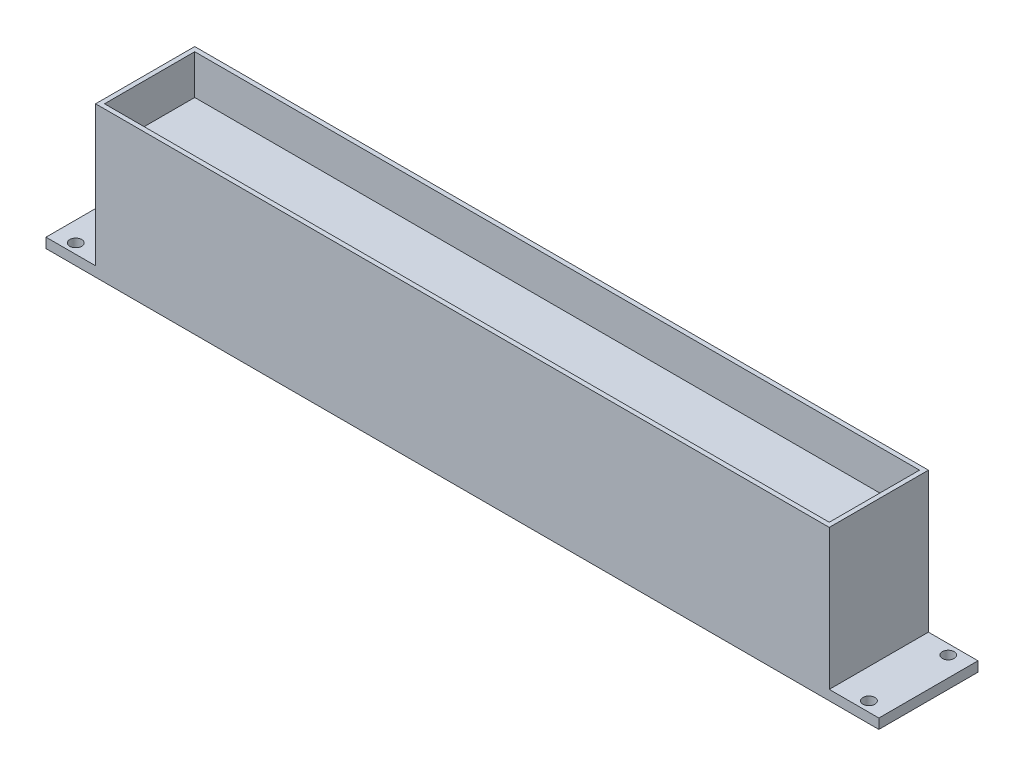
ISO-10303-21;
HEADER;
FILE_DESCRIPTION(('STEP AP214'),'2;1');
FILE_NAME('part.step','',(''),(''),'','','');
FILE_SCHEMA(('AUTOMOTIVE_DESIGN { 1 0 10303 214 1 1 1 1 }'));
ENDSEC;
DATA;
#1=APPLICATION_CONTEXT('core data for automotive mechanical design processes');
#2=APPLICATION_PROTOCOL_DEFINITION('international standard','automotive_design',2000,#1);
#3=PRODUCT_CONTEXT('',#1,'mechanical');
#4=PRODUCT('Part','Part','',(#3));
#5=PRODUCT_RELATED_PRODUCT_CATEGORY('part','',(#4));
#6=PRODUCT_DEFINITION_FORMATION('','',#4);
#7=PRODUCT_DEFINITION_CONTEXT('part definition',#1,'design');
#8=PRODUCT_DEFINITION('design','',#6,#7);
#9=PRODUCT_DEFINITION_SHAPE('','',#8);
#10=(LENGTH_UNIT() NAMED_UNIT(*) SI_UNIT(.MILLI.,.METRE.));
#11=(NAMED_UNIT(*) PLANE_ANGLE_UNIT() SI_UNIT($,.RADIAN.));
#12=(NAMED_UNIT(*) SI_UNIT($,.STERADIAN.) SOLID_ANGLE_UNIT());
#13=UNCERTAINTY_MEASURE_WITH_UNIT(LENGTH_MEASURE(1.E-05),#10,'distance_accuracy_value','');
#14=(GEOMETRIC_REPRESENTATION_CONTEXT(3) GLOBAL_UNCERTAINTY_ASSIGNED_CONTEXT((#13)) GLOBAL_UNIT_ASSIGNED_CONTEXT((#10,
#11,#12)) REPRESENTATION_CONTEXT('',''));
#15=CARTESIAN_POINT('',(0.,0.,0.));
#16=DIRECTION('',(0.,0.,1.));
#17=DIRECTION('',(1.,0.,0.));
#18=AXIS2_PLACEMENT_3D('',#15,#16,#17);
#19=CARTESIAN_POINT('',(0.,75.75,0.));
#20=DIRECTION('',(0.,-1.,0.));
#21=DIRECTION('',(0.,0.,-1.));
#22=AXIS2_PLACEMENT_3D('',#19,#20,#21);
#23=PLANE('',#22);
#24=DIRECTION('',(-1.,0.,0.));
#25=VECTOR('',#24,1.);
#26=CARTESIAN_POINT('',(-182.75,75.75,-22.75));
#27=LINE('',#26,#25);
#28=CARTESIAN_POINT('',(182.75,75.75,-22.75));
#29=VERTEX_POINT('',#28);
#30=CARTESIAN_POINT('',(-182.75,75.75,-22.75));
#31=VERTEX_POINT('',#30);
#32=EDGE_CURVE('E211',#29,#31,#27,.T.);
#33=ORIENTED_EDGE('',*,*,#32,.F.);
#34=DIRECTION('',(0.,0.,-1.));
#35=VECTOR('',#34,1.);
#36=CARTESIAN_POINT('',(182.75,75.75,22.75));
#37=LINE('',#36,#35);
#38=CARTESIAN_POINT('',(182.75,75.75,22.75));
#39=VERTEX_POINT('',#38);
#40=EDGE_CURVE('E176',#39,#29,#37,.T.);
#41=ORIENTED_EDGE('',*,*,#40,.F.);
#42=DIRECTION('',(1.,0.,0.));
#43=VECTOR('',#42,1.);
#44=CARTESIAN_POINT('',(-182.75,75.75,22.75));
#45=LINE('',#44,#43);
#46=CARTESIAN_POINT('',(-182.75,75.75,22.75));
#47=VERTEX_POINT('',#46);
#48=EDGE_CURVE('E196',#47,#39,#45,.T.);
#49=ORIENTED_EDGE('',*,*,#48,.F.);
#50=DIRECTION('',(0.,0.,1.));
#51=VECTOR('',#50,1.);
#52=CARTESIAN_POINT('',(-182.75,75.75,22.75));
#53=LINE('',#52,#51);
#54=EDGE_CURVE('E215',#31,#47,#53,.T.);
#55=ORIENTED_EDGE('',*,*,#54,.F.);
#56=EDGE_LOOP('',(#33,#41,#49,#55));
#57=FACE_BOUND('',#56,.T.);
#58=DIRECTION('',(0.,0.,-1.));
#59=VECTOR('',#58,1.);
#60=CARTESIAN_POINT('',(185.,75.75,25.));
#61=LINE('',#60,#59);
#62=CARTESIAN_POINT('',(185.,75.75,25.));
#63=VERTEX_POINT('',#62);
#64=CARTESIAN_POINT('',(185.,75.75,-25.));
#65=VERTEX_POINT('',#64);
#66=EDGE_CURVE('E282',#63,#65,#61,.T.);
#67=ORIENTED_EDGE('',*,*,#66,.T.);
#68=DIRECTION('',(-1.,0.,0.));
#69=VECTOR('',#68,1.);
#70=CARTESIAN_POINT('',(-210.,75.75,-25.));
#71=LINE('',#70,#69);
#72=CARTESIAN_POINT('',(-185.,75.75,-25.));
#73=VERTEX_POINT('',#72);
#74=EDGE_CURVE('E160',#65,#73,#71,.T.);
#75=ORIENTED_EDGE('',*,*,#74,.T.);
#76=DIRECTION('',(0.,0.,-1.));
#77=VECTOR('',#76,1.);
#78=CARTESIAN_POINT('',(-185.,75.75,25.));
#79=LINE('',#78,#77);
#80=CARTESIAN_POINT('',(-185.,75.75,25.));
#81=VERTEX_POINT('',#80);
#82=EDGE_CURVE('E290',#81,#73,#79,.T.);
#83=ORIENTED_EDGE('',*,*,#82,.F.);
#84=DIRECTION('',(1.,0.,0.));
#85=VECTOR('',#84,1.);
#86=CARTESIAN_POINT('',(-210.,75.75,25.));
#87=LINE('',#86,#85);
#88=EDGE_CURVE('E154',#81,#63,#87,.T.);
#89=ORIENTED_EDGE('',*,*,#88,.T.);
#90=EDGE_LOOP('',(#67,#75,#83,#89));
#91=FACE_BOUND('',#90,.T.);
#92=ADVANCED_FACE('F40',(#57,#91),#23,.F.);
#93=CARTESIAN_POINT('',(-210.,75.75,-25.));
#94=DIRECTION('',(0.,0.,1.));
#95=DIRECTION('',(1.,0.,0.));
#96=AXIS2_PLACEMENT_3D('',#93,#94,#95);
#97=PLANE('',#96);
#98=DIRECTION('',(0.,1.,0.));
#99=VECTOR('',#98,1.);
#100=CARTESIAN_POINT('',(185.,-55.9016994374947,-25.));
#101=LINE('',#100,#99);
#102=CARTESIAN_POINT('',(185.,5.,-25.));
#103=VERTEX_POINT('',#102);
#104=EDGE_CURVE('E138',#103,#65,#101,.T.);
#105=ORIENTED_EDGE('',*,*,#104,.F.);
#106=DIRECTION('',(1.,0.,0.));
#107=VECTOR('',#106,1.);
#108=CARTESIAN_POINT('',(185.,5.,-25.));
#109=LINE('',#108,#107);
#110=CARTESIAN_POINT('',(210.,5.,-25.));
#111=VERTEX_POINT('',#110);
#112=EDGE_CURVE('E146',#103,#111,#109,.T.);
#113=ORIENTED_EDGE('',*,*,#112,.T.);
#114=DIRECTION('',(0.,-1.,0.));
#115=VECTOR('',#114,1.);
#116=CARTESIAN_POINT('',(210.,75.75,-25.));
#117=LINE('',#116,#115);
#118=CARTESIAN_POINT('',(210.,0.,-25.));
#119=VERTEX_POINT('',#118);
#120=EDGE_CURVE('E12',#111,#119,#117,.T.);
#121=ORIENTED_EDGE('',*,*,#120,.T.);
#122=DIRECTION('',(-1.,0.,0.));
#123=VECTOR('',#122,1.);
#124=CARTESIAN_POINT('',(-210.,0.,-25.));
#125=LINE('',#124,#123);
#126=CARTESIAN_POINT('',(-210.,0.,-25.));
#127=VERTEX_POINT('',#126);
#128=EDGE_CURVE('E255',#119,#127,#125,.T.);
#129=ORIENTED_EDGE('',*,*,#128,.T.);
#130=DIRECTION('',(0.,-1.,0.));
#131=VECTOR('',#130,1.);
#132=CARTESIAN_POINT('',(-210.,75.75,-25.));
#133=LINE('',#132,#131);
#134=CARTESIAN_POINT('',(-210.,5.,-25.));
#135=VERTEX_POINT('',#134);
#136=EDGE_CURVE('E50',#135,#127,#133,.T.);
#137=ORIENTED_EDGE('',*,*,#136,.F.);
#138=DIRECTION('',(-1.,0.,0.));
#139=VECTOR('',#138,1.);
#140=CARTESIAN_POINT('',(-185.,5.,-25.));
#141=LINE('',#140,#139);
#142=CARTESIAN_POINT('',(-185.,5.,-25.));
#143=VERTEX_POINT('',#142);
#144=EDGE_CURVE('E294',#143,#135,#141,.T.);
#145=ORIENTED_EDGE('',*,*,#144,.F.);
#146=DIRECTION('',(0.,1.,0.));
#147=VECTOR('',#146,1.);
#148=CARTESIAN_POINT('',(-185.,-55.9016994374947,-25.));
#149=LINE('',#148,#147);
#150=EDGE_CURVE('E170',#143,#73,#149,.T.);
#151=ORIENTED_EDGE('',*,*,#150,.T.);
#152=ORIENTED_EDGE('',*,*,#74,.F.);
#153=EDGE_LOOP('',(#105,#113,#121,#129,#137,#145,#151,#152));
#154=FACE_BOUND('',#153,.T.);
#155=ADVANCED_FACE('F273',(#154),#97,.F.);
#156=CARTESIAN_POINT('',(-210.,75.75,25.));
#157=DIRECTION('',(0.,0.,-1.));
#158=DIRECTION('',(-1.,0.,0.));
#159=AXIS2_PLACEMENT_3D('',#156,#157,#158);
#160=PLANE('',#159);
#161=DIRECTION('',(0.,1.,0.));
#162=VECTOR('',#161,1.);
#163=CARTESIAN_POINT('',(185.,-55.9016994374947,25.));
#164=LINE('',#163,#162);
#165=CARTESIAN_POINT('',(185.,5.,25.));
#166=VERTEX_POINT('',#165);
#167=EDGE_CURVE('E283',#166,#63,#164,.T.);
#168=ORIENTED_EDGE('',*,*,#167,.T.);
#169=ORIENTED_EDGE('',*,*,#88,.F.);
#170=DIRECTION('',(0.,1.,0.));
#171=VECTOR('',#170,1.);
#172=CARTESIAN_POINT('',(-185.,-55.9016994374947,25.));
#173=LINE('',#172,#171);
#174=CARTESIAN_POINT('',(-185.,5.,25.));
#175=VERTEX_POINT('',#174);
#176=EDGE_CURVE('E186',#175,#81,#173,.T.);
#177=ORIENTED_EDGE('',*,*,#176,.F.);
#178=DIRECTION('',(1.,0.,0.));
#179=VECTOR('',#178,1.);
#180=CARTESIAN_POINT('',(-185.,5.,25.));
#181=LINE('',#180,#179);
#182=CARTESIAN_POINT('',(-210.,5.,25.));
#183=VERTEX_POINT('',#182);
#184=EDGE_CURVE('E66',#183,#175,#181,.T.);
#185=ORIENTED_EDGE('',*,*,#184,.F.);
#186=DIRECTION('',(0.,-1.,0.));
#187=VECTOR('',#186,1.);
#188=CARTESIAN_POINT('',(-210.,75.75,25.));
#189=LINE('',#188,#187);
#190=CARTESIAN_POINT('',(-210.,0.,25.));
#191=VERTEX_POINT('',#190);
#192=EDGE_CURVE('E153',#183,#191,#189,.T.);
#193=ORIENTED_EDGE('',*,*,#192,.T.);
#194=DIRECTION('',(1.,0.,0.));
#195=VECTOR('',#194,1.);
#196=CARTESIAN_POINT('',(-210.,0.,25.));
#197=LINE('',#196,#195);
#198=CARTESIAN_POINT('',(210.,0.,25.));
#199=VERTEX_POINT('',#198);
#200=EDGE_CURVE('E150',#191,#199,#197,.T.);
#201=ORIENTED_EDGE('',*,*,#200,.T.);
#202=DIRECTION('',(0.,-1.,0.));
#203=VECTOR('',#202,1.);
#204=CARTESIAN_POINT('',(210.,75.75,25.));
#205=LINE('',#204,#203);
#206=CARTESIAN_POINT('',(210.,5.,25.));
#207=VERTEX_POINT('',#206);
#208=EDGE_CURVE('E143',#207,#199,#205,.T.);
#209=ORIENTED_EDGE('',*,*,#208,.F.);
#210=DIRECTION('',(-1.,0.,0.));
#211=VECTOR('',#210,1.);
#212=CARTESIAN_POINT('',(185.,5.,25.));
#213=LINE('',#212,#211);
#214=EDGE_CURVE('E129',#207,#166,#213,.T.);
#215=ORIENTED_EDGE('',*,*,#214,.T.);
#216=EDGE_LOOP('',(#168,#169,#177,#185,#193,#201,#209,#215));
#217=FACE_BOUND('',#216,.T.);
#218=ADVANCED_FACE('F148',(#217),#160,.F.);
#219=CARTESIAN_POINT('',(0.,0.,0.));
#220=DIRECTION('',(0.,-1.,0.));
#221=DIRECTION('',(0.,0.,-1.));
#222=AXIS2_PLACEMENT_3D('',#219,#220,#221);
#223=PLANE('',#222);
#224=CARTESIAN_POINT('',(-200.,0.,-20.));
#225=DIRECTION('',(0.,1.,0.));
#226=DIRECTION('',(0.,0.,1.));
#227=AXIS2_PLACEMENT_3D('',#224,#225,#226);
#228=CIRCLE('',#227,2.99999999999999);
#229=CARTESIAN_POINT('',(-200.,0.,-17.));
#230=VERTEX_POINT('',#229);
#231=EDGE_CURVE('E238',#230,#230,#228,.T.);
#232=ORIENTED_EDGE('',*,*,#231,.T.);
#233=EDGE_LOOP('',(#232));
#234=FACE_BOUND('',#233,.T.);
#235=CARTESIAN_POINT('',(-200.,0.,20.));
#236=DIRECTION('',(0.,1.,0.));
#237=DIRECTION('',(0.,0.,1.));
#238=AXIS2_PLACEMENT_3D('',#235,#236,#237);
#239=CIRCLE('',#238,2.99999999999999);
#240=CARTESIAN_POINT('',(-200.,0.,23.));
#241=VERTEX_POINT('',#240);
#242=EDGE_CURVE('E246',#241,#241,#239,.T.);
#243=ORIENTED_EDGE('',*,*,#242,.T.);
#244=EDGE_LOOP('',(#243));
#245=FACE_BOUND('',#244,.T.);
#246=DIRECTION('',(0.,0.,-1.));
#247=VECTOR('',#246,1.);
#248=CARTESIAN_POINT('',(210.,0.,25.));
#249=LINE('',#248,#247);
#250=EDGE_CURVE('E250',#199,#119,#249,.T.);
#251=ORIENTED_EDGE('',*,*,#250,.F.);
#252=ORIENTED_EDGE('',*,*,#200,.F.);
#253=DIRECTION('',(0.,0.,1.));
#254=VECTOR('',#253,1.);
#255=CARTESIAN_POINT('',(-210.,0.,25.));
#256=LINE('',#255,#254);
#257=EDGE_CURVE('E258',#127,#191,#256,.T.);
#258=ORIENTED_EDGE('',*,*,#257,.F.);
#259=ORIENTED_EDGE('',*,*,#128,.F.);
#260=EDGE_LOOP('',(#251,#252,#258,#259));
#261=FACE_BOUND('',#260,.T.);
#262=CARTESIAN_POINT('',(200.,0.,20.));
#263=DIRECTION('',(0.,1.,0.));
#264=DIRECTION('',(0.,0.,1.));
#265=AXIS2_PLACEMENT_3D('',#262,#263,#264);
#266=CIRCLE('',#265,2.99999999999999);
#267=CARTESIAN_POINT('',(200.,0.,23.));
#268=VERTEX_POINT('',#267);
#269=EDGE_CURVE('E242',#268,#268,#266,.T.);
#270=ORIENTED_EDGE('',*,*,#269,.T.);
#271=EDGE_LOOP('',(#270));
#272=FACE_BOUND('',#271,.T.);
#273=CARTESIAN_POINT('',(200.,0.,-20.));
#274=DIRECTION('',(0.,1.,0.));
#275=DIRECTION('',(0.,0.,-1.));
#276=AXIS2_PLACEMENT_3D('',#273,#274,#275);
#277=CIRCLE('',#276,2.99999999999999);
#278=CARTESIAN_POINT('',(200.,0.,-23.));
#279=VERTEX_POINT('',#278);
#280=EDGE_CURVE('E225',#279,#279,#277,.T.);
#281=ORIENTED_EDGE('',*,*,#280,.T.);
#282=EDGE_LOOP('',(#281));
#283=FACE_BOUND('',#282,.T.);
#284=ADVANCED_FACE('F270',(#234,#245,#261,#272,#283),#223,.T.);
#285=CARTESIAN_POINT('',(210.,75.75,25.));
#286=DIRECTION('',(-1.,0.,0.));
#287=DIRECTION('',(0.,0.,1.));
#288=AXIS2_PLACEMENT_3D('',#285,#286,#287);
#289=PLANE('',#288);
#290=ORIENTED_EDGE('',*,*,#120,.F.);
#291=DIRECTION('',(0.,0.,1.));
#292=VECTOR('',#291,1.);
#293=CARTESIAN_POINT('',(210.,5.,25.));
#294=LINE('',#293,#292);
#295=EDGE_CURVE('E132',#111,#207,#294,.T.);
#296=ORIENTED_EDGE('',*,*,#295,.T.);
#297=ORIENTED_EDGE('',*,*,#208,.T.);
#298=ORIENTED_EDGE('',*,*,#250,.T.);
#299=EDGE_LOOP('',(#290,#296,#297,#298));
#300=FACE_BOUND('',#299,.T.);
#301=ADVANCED_FACE('F42',(#300),#289,.F.);
#302=CARTESIAN_POINT('',(-210.,75.75,25.));
#303=DIRECTION('',(1.,0.,0.));
#304=DIRECTION('',(0.,0.,-1.));
#305=AXIS2_PLACEMENT_3D('',#302,#303,#304);
#306=PLANE('',#305);
#307=ORIENTED_EDGE('',*,*,#192,.F.);
#308=DIRECTION('',(0.,0.,1.));
#309=VECTOR('',#308,1.);
#310=CARTESIAN_POINT('',(-210.,5.,25.));
#311=LINE('',#310,#309);
#312=EDGE_CURVE('E296',#135,#183,#311,.T.);
#313=ORIENTED_EDGE('',*,*,#312,.F.);
#314=ORIENTED_EDGE('',*,*,#136,.T.);
#315=ORIENTED_EDGE('',*,*,#257,.T.);
#316=EDGE_LOOP('',(#307,#313,#314,#315));
#317=FACE_BOUND('',#316,.T.);
#318=ADVANCED_FACE('F265',(#317),#306,.F.);
#319=CARTESIAN_POINT('',(-200.,75.75,20.));
#320=DIRECTION('',(0.,-1.,0.));
#321=DIRECTION('',(0.,0.,-1.));
#322=AXIS2_PLACEMENT_3D('',#319,#320,#321);
#323=CYLINDRICAL_SURFACE('',#322,2.99999999999999);
#324=CARTESIAN_POINT('',(-200.,5.,20.));
#325=DIRECTION('',(0.,-1.,0.));
#326=DIRECTION('',(0.,0.,-1.));
#327=AXIS2_PLACEMENT_3D('',#324,#325,#326);
#328=CIRCLE('',#327,2.99999999999999);
#329=CARTESIAN_POINT('',(-200.,5.,17.));
#330=VERTEX_POINT('',#329);
#331=EDGE_CURVE('E169',#330,#330,#328,.T.);
#332=ORIENTED_EDGE('',*,*,#331,.F.);
#333=EDGE_LOOP('',(#332));
#334=FACE_BOUND('',#333,.T.);
#335=ORIENTED_EDGE('',*,*,#242,.F.);
#336=EDGE_LOOP('',(#335));
#337=FACE_BOUND('',#336,.T.);
#338=ADVANCED_FACE('F331',(#334,#337),#323,.F.);
#339=CARTESIAN_POINT('',(200.,75.75,20.));
#340=DIRECTION('',(0.,-1.,0.));
#341=DIRECTION('',(0.,0.,-1.));
#342=AXIS2_PLACEMENT_3D('',#339,#340,#341);
#343=CYLINDRICAL_SURFACE('',#342,2.99999999999999);
#344=CARTESIAN_POINT('',(200.,5.,20.));
#345=DIRECTION('',(0.,-1.,0.));
#346=DIRECTION('',(0.,0.,-1.));
#347=AXIS2_PLACEMENT_3D('',#344,#345,#346);
#348=CIRCLE('',#347,2.99999999999999);
#349=CARTESIAN_POINT('',(200.,5.,17.));
#350=VERTEX_POINT('',#349);
#351=EDGE_CURVE('E286',#350,#350,#348,.T.);
#352=ORIENTED_EDGE('',*,*,#351,.F.);
#353=EDGE_LOOP('',(#352));
#354=FACE_BOUND('',#353,.T.);
#355=ORIENTED_EDGE('',*,*,#269,.F.);
#356=EDGE_LOOP('',(#355));
#357=FACE_BOUND('',#356,.T.);
#358=ADVANCED_FACE('F343',(#354,#357),#343,.F.);
#359=CARTESIAN_POINT('',(-200.,75.75,-20.));
#360=DIRECTION('',(0.,-1.,0.));
#361=DIRECTION('',(0.,0.,-1.));
#362=AXIS2_PLACEMENT_3D('',#359,#360,#361);
#363=CYLINDRICAL_SURFACE('',#362,2.99999999999999);
#364=CARTESIAN_POINT('',(-200.,5.,-20.));
#365=DIRECTION('',(0.,-1.,0.));
#366=DIRECTION('',(0.,0.,-1.));
#367=AXIS2_PLACEMENT_3D('',#364,#365,#366);
#368=CIRCLE('',#367,2.99999999999999);
#369=CARTESIAN_POINT('',(-200.,5.,-23.));
#370=VERTEX_POINT('',#369);
#371=EDGE_CURVE('E166',#370,#370,#368,.T.);
#372=ORIENTED_EDGE('',*,*,#371,.F.);
#373=EDGE_LOOP('',(#372));
#374=FACE_BOUND('',#373,.T.);
#375=ORIENTED_EDGE('',*,*,#231,.F.);
#376=EDGE_LOOP('',(#375));
#377=FACE_BOUND('',#376,.T.);
#378=ADVANCED_FACE('F356',(#374,#377),#363,.F.);
#379=CARTESIAN_POINT('',(200.,75.75,-20.));
#380=DIRECTION('',(0.,-1.,0.));
#381=DIRECTION('',(0.,0.,-1.));
#382=AXIS2_PLACEMENT_3D('',#379,#380,#381);
#383=CYLINDRICAL_SURFACE('',#382,2.99999999999999);
#384=CARTESIAN_POINT('',(200.,5.,-20.));
#385=DIRECTION('',(0.,-1.,0.));
#386=DIRECTION('',(0.,0.,-1.));
#387=AXIS2_PLACEMENT_3D('',#384,#385,#386);
#388=CIRCLE('',#387,2.99999999999999);
#389=CARTESIAN_POINT('',(200.,5.,-23.));
#390=VERTEX_POINT('',#389);
#391=EDGE_CURVE('E44',#390,#390,#388,.T.);
#392=ORIENTED_EDGE('',*,*,#391,.F.);
#393=EDGE_LOOP('',(#392));
#394=FACE_BOUND('',#393,.T.);
#395=ORIENTED_EDGE('',*,*,#280,.F.);
#396=EDGE_LOOP('',(#395));
#397=FACE_BOUND('',#396,.T.);
#398=ADVANCED_FACE('F362',(#394,#397),#383,.F.);
#399=CARTESIAN_POINT('',(182.75,55.75,22.75));
#400=DIRECTION('',(1.,0.,0.));
#401=DIRECTION('',(0.,0.,-1.));
#402=AXIS2_PLACEMENT_3D('',#399,#400,#401);
#403=PLANE('',#402);
#404=ORIENTED_EDGE('',*,*,#40,.T.);
#405=DIRECTION('',(0.,1.,0.));
#406=VECTOR('',#405,1.);
#407=CARTESIAN_POINT('',(182.75,55.75,-22.75));
#408=LINE('',#407,#406);
#409=CARTESIAN_POINT('',(182.75,55.75,-22.75));
#410=VERTEX_POINT('',#409);
#411=EDGE_CURVE('E208',#410,#29,#408,.T.);
#412=ORIENTED_EDGE('',*,*,#411,.F.);
#413=DIRECTION('',(0.,0.,-1.));
#414=VECTOR('',#413,1.);
#415=CARTESIAN_POINT('',(182.75,55.75,22.75));
#416=LINE('',#415,#414);
#417=CARTESIAN_POINT('',(182.75,55.75,22.75));
#418=VERTEX_POINT('',#417);
#419=EDGE_CURVE('E191',#418,#410,#416,.T.);
#420=ORIENTED_EDGE('',*,*,#419,.F.);
#421=DIRECTION('',(0.,1.,0.));
#422=VECTOR('',#421,1.);
#423=CARTESIAN_POINT('',(182.75,55.75,22.75));
#424=LINE('',#423,#422);
#425=EDGE_CURVE('E222',#418,#39,#424,.T.);
#426=ORIENTED_EDGE('',*,*,#425,.T.);
#427=EDGE_LOOP('',(#404,#412,#420,#426));
#428=FACE_BOUND('',#427,.T.);
#429=ADVANCED_FACE('F365',(#428),#403,.F.);
#430=CARTESIAN_POINT('',(-182.75,55.75,22.75));
#431=DIRECTION('',(0.,0.,1.));
#432=DIRECTION('',(1.,0.,0.));
#433=AXIS2_PLACEMENT_3D('',#430,#431,#432);
#434=PLANE('',#433);
#435=ORIENTED_EDGE('',*,*,#48,.T.);
#436=ORIENTED_EDGE('',*,*,#425,.F.);
#437=DIRECTION('',(1.,0.,0.));
#438=VECTOR('',#437,1.);
#439=CARTESIAN_POINT('',(-182.75,55.75,22.75));
#440=LINE('',#439,#438);
#441=CARTESIAN_POINT('',(-182.75,55.75,22.75));
#442=VERTEX_POINT('',#441);
#443=EDGE_CURVE('E204',#442,#418,#440,.T.);
#444=ORIENTED_EDGE('',*,*,#443,.F.);
#445=DIRECTION('',(0.,1.,0.));
#446=VECTOR('',#445,1.);
#447=CARTESIAN_POINT('',(-182.75,55.75,22.75));
#448=LINE('',#447,#446);
#449=EDGE_CURVE('E226',#442,#47,#448,.T.);
#450=ORIENTED_EDGE('',*,*,#449,.T.);
#451=EDGE_LOOP('',(#435,#436,#444,#450));
#452=FACE_BOUND('',#451,.T.);
#453=ADVANCED_FACE('F432',(#452),#434,.F.);
#454=CARTESIAN_POINT('',(-182.75,55.75,22.75));
#455=DIRECTION('',(-1.,0.,0.));
#456=DIRECTION('',(0.,0.,1.));
#457=AXIS2_PLACEMENT_3D('',#454,#455,#456);
#458=PLANE('',#457);
#459=ORIENTED_EDGE('',*,*,#54,.T.);
#460=ORIENTED_EDGE('',*,*,#449,.F.);
#461=DIRECTION('',(0.,0.,1.));
#462=VECTOR('',#461,1.);
#463=CARTESIAN_POINT('',(-182.75,55.75,22.75));
#464=LINE('',#463,#462);
#465=CARTESIAN_POINT('',(-182.75,55.75,-22.75));
#466=VERTEX_POINT('',#465);
#467=EDGE_CURVE('E200',#466,#442,#464,.T.);
#468=ORIENTED_EDGE('',*,*,#467,.F.);
#469=DIRECTION('',(0.,1.,0.));
#470=VECTOR('',#469,1.);
#471=CARTESIAN_POINT('',(-182.75,55.75,-22.75));
#472=LINE('',#471,#470);
#473=EDGE_CURVE('E229',#466,#31,#472,.T.);
#474=ORIENTED_EDGE('',*,*,#473,.T.);
#475=EDGE_LOOP('',(#459,#460,#468,#474));
#476=FACE_BOUND('',#475,.T.);
#477=ADVANCED_FACE('F423',(#476),#458,.F.);
#478=CARTESIAN_POINT('',(-182.75,55.75,-22.75));
#479=DIRECTION('',(0.,0.,-1.));
#480=DIRECTION('',(-1.,0.,0.));
#481=AXIS2_PLACEMENT_3D('',#478,#479,#480);
#482=PLANE('',#481);
#483=ORIENTED_EDGE('',*,*,#32,.T.);
#484=ORIENTED_EDGE('',*,*,#473,.F.);
#485=DIRECTION('',(-1.,0.,0.));
#486=VECTOR('',#485,1.);
#487=CARTESIAN_POINT('',(-182.75,55.75,-22.75));
#488=LINE('',#487,#486);
#489=EDGE_CURVE('E195',#410,#466,#488,.T.);
#490=ORIENTED_EDGE('',*,*,#489,.F.);
#491=ORIENTED_EDGE('',*,*,#411,.T.);
#492=EDGE_LOOP('',(#483,#484,#490,#491));
#493=FACE_BOUND('',#492,.T.);
#494=ADVANCED_FACE('F414',(#493),#482,.F.);
#495=CARTESIAN_POINT('',(0.,55.75,0.));
#496=DIRECTION('',(0.,-1.,0.));
#497=DIRECTION('',(0.,0.,-1.));
#498=AXIS2_PLACEMENT_3D('',#495,#496,#497);
#499=PLANE('',#498);
#500=ORIENTED_EDGE('',*,*,#419,.T.);
#501=ORIENTED_EDGE('',*,*,#489,.T.);
#502=ORIENTED_EDGE('',*,*,#467,.T.);
#503=ORIENTED_EDGE('',*,*,#443,.T.);
#504=EDGE_LOOP('',(#500,#501,#502,#503));
#505=FACE_BOUND('',#504,.T.);
#506=ADVANCED_FACE('F406',(#505),#499,.F.);
#507=CARTESIAN_POINT('',(0.,5.,0.));
#508=DIRECTION('',(0.,-1.,0.));
#509=DIRECTION('',(0.,0.,-1.));
#510=AXIS2_PLACEMENT_3D('',#507,#508,#509);
#511=PLANE('',#510);
#512=ORIENTED_EDGE('',*,*,#331,.T.);
#513=EDGE_LOOP('',(#512));
#514=FACE_BOUND('',#513,.T.);
#515=ORIENTED_EDGE('',*,*,#371,.T.);
#516=EDGE_LOOP('',(#515));
#517=FACE_BOUND('',#516,.T.);
#518=DIRECTION('',(0.,0.,-1.));
#519=VECTOR('',#518,1.);
#520=CARTESIAN_POINT('',(-185.,5.,25.));
#521=LINE('',#520,#519);
#522=EDGE_CURVE('E179',#175,#143,#521,.T.);
#523=ORIENTED_EDGE('',*,*,#522,.T.);
#524=ORIENTED_EDGE('',*,*,#144,.T.);
#525=ORIENTED_EDGE('',*,*,#312,.T.);
#526=ORIENTED_EDGE('',*,*,#184,.T.);
#527=EDGE_LOOP('',(#523,#524,#525,#526));
#528=FACE_BOUND('',#527,.T.);
#529=ADVANCED_FACE('F300',(#514,#517,#528),#511,.F.);
#530=CARTESIAN_POINT('',(-185.,-55.9016994374947,25.));
#531=DIRECTION('',(1.,0.,0.));
#532=DIRECTION('',(0.,0.,-1.));
#533=AXIS2_PLACEMENT_3D('',#530,#531,#532);
#534=PLANE('',#533);
#535=ORIENTED_EDGE('',*,*,#176,.T.);
#536=ORIENTED_EDGE('',*,*,#82,.T.);
#537=ORIENTED_EDGE('',*,*,#150,.F.);
#538=ORIENTED_EDGE('',*,*,#522,.F.);
#539=EDGE_LOOP('',(#535,#536,#537,#538));
#540=FACE_BOUND('',#539,.T.);
#541=ADVANCED_FACE('F306',(#540),#534,.F.);
#542=CARTESIAN_POINT('',(185.,-55.9016994374947,25.));
#543=DIRECTION('',(1.,0.,0.));
#544=DIRECTION('',(0.,0.,-1.));
#545=AXIS2_PLACEMENT_3D('',#542,#543,#544);
#546=PLANE('',#545);
#547=DIRECTION('',(0.,0.,-1.));
#548=VECTOR('',#547,1.);
#549=CARTESIAN_POINT('',(185.,5.,25.));
#550=LINE('',#549,#548);
#551=EDGE_CURVE('E58',#166,#103,#550,.T.);
#552=ORIENTED_EDGE('',*,*,#551,.T.);
#553=ORIENTED_EDGE('',*,*,#104,.T.);
#554=ORIENTED_EDGE('',*,*,#66,.F.);
#555=ORIENTED_EDGE('',*,*,#167,.F.);
#556=EDGE_LOOP('',(#552,#553,#554,#555));
#557=FACE_BOUND('',#556,.T.);
#558=ADVANCED_FACE('F311',(#557),#546,.T.);
#559=CARTESIAN_POINT('',(0.,5.,0.));
#560=DIRECTION('',(0.,-1.,0.));
#561=DIRECTION('',(0.,0.,-1.));
#562=AXIS2_PLACEMENT_3D('',#559,#560,#561);
#563=PLANE('',#562);
#564=ORIENTED_EDGE('',*,*,#351,.T.);
#565=EDGE_LOOP('',(#564));
#566=FACE_BOUND('',#565,.T.);
#567=ORIENTED_EDGE('',*,*,#391,.T.);
#568=EDGE_LOOP('',(#567));
#569=FACE_BOUND('',#568,.T.);
#570=ORIENTED_EDGE('',*,*,#214,.F.);
#571=ORIENTED_EDGE('',*,*,#295,.F.);
#572=ORIENTED_EDGE('',*,*,#112,.F.);
#573=ORIENTED_EDGE('',*,*,#551,.F.);
#574=EDGE_LOOP('',(#570,#571,#572,#573));
#575=FACE_BOUND('',#574,.T.);
#576=ADVANCED_FACE('F131',(#566,#569,#575),#563,.F.);
#577=CLOSED_SHELL('',(#92,#155,#218,#284,#301,#318,#338,#358,#378,#398,#429,#453,#477,#494,#506,
#529,#541,#558,#576));
#578=MANIFOLD_SOLID_BREP('B2',#577);
#579=ADVANCED_BREP_SHAPE_REPRESENTATION('',(#18,#578),#14);
#580=SHAPE_DEFINITION_REPRESENTATION(#9,#579);
ENDSEC;
END-ISO-10303-21;
